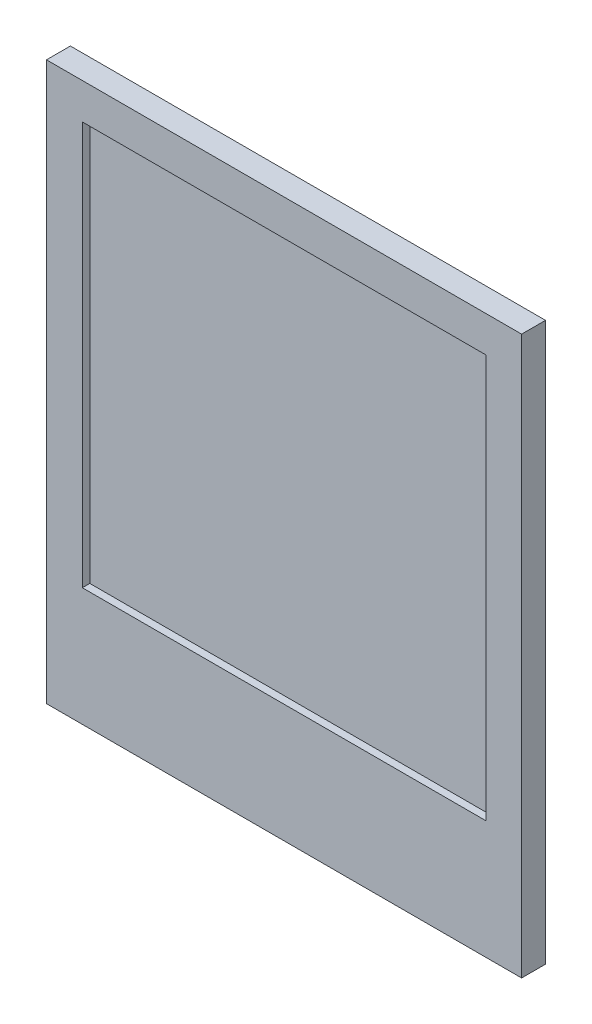
ISO-10303-21;
HEADER;
FILE_DESCRIPTION(('STEP AP214'),'2;1');
FILE_NAME('part.step','',(''),(''),'','','');
FILE_SCHEMA(('AUTOMOTIVE_DESIGN { 1 0 10303 214 1 1 1 1 }'));
ENDSEC;
DATA;
#1=APPLICATION_CONTEXT('core data for automotive mechanical design processes');
#2=APPLICATION_PROTOCOL_DEFINITION('international standard','automotive_design',2000,#1);
#3=PRODUCT_CONTEXT('',#1,'mechanical');
#4=PRODUCT('Part','Part','',(#3));
#5=PRODUCT_RELATED_PRODUCT_CATEGORY('part','',(#4));
#6=PRODUCT_DEFINITION_FORMATION('','',#4);
#7=PRODUCT_DEFINITION_CONTEXT('part definition',#1,'design');
#8=PRODUCT_DEFINITION('design','',#6,#7);
#9=PRODUCT_DEFINITION_SHAPE('','',#8);
#10=(LENGTH_UNIT() NAMED_UNIT(*) SI_UNIT(.MILLI.,.METRE.));
#11=(NAMED_UNIT(*) PLANE_ANGLE_UNIT() SI_UNIT($,.RADIAN.));
#12=(NAMED_UNIT(*) SI_UNIT($,.STERADIAN.) SOLID_ANGLE_UNIT());
#13=UNCERTAINTY_MEASURE_WITH_UNIT(LENGTH_MEASURE(1.E-05),#10,'distance_accuracy_value','');
#14=(GEOMETRIC_REPRESENTATION_CONTEXT(3) GLOBAL_UNCERTAINTY_ASSIGNED_CONTEXT((#13)) GLOBAL_UNIT_ASSIGNED_CONTEXT((#10,
#11,#12)) REPRESENTATION_CONTEXT('',''));
#15=CARTESIAN_POINT('',(0.,0.,0.));
#16=DIRECTION('',(0.,0.,1.));
#17=DIRECTION('',(1.,0.,0.));
#18=AXIS2_PLACEMENT_3D('',#15,#16,#17);
#19=CARTESIAN_POINT('',(15.9,18.66,1.6));
#20=DIRECTION('',(-1.,0.,0.));
#21=DIRECTION('',(0.,-1.,0.));
#22=AXIS2_PLACEMENT_3D('',#19,#20,#21);
#23=PLANE('',#22);
#24=DIRECTION('',(0.,1.,0.));
#25=VECTOR('',#24,1.);
#26=CARTESIAN_POINT('',(15.9,18.66,0.));
#27=LINE('',#26,#25);
#28=CARTESIAN_POINT('',(15.9,-18.66,0.));
#29=VERTEX_POINT('',#28);
#30=CARTESIAN_POINT('',(15.9,18.66,0.));
#31=VERTEX_POINT('',#30);
#32=EDGE_CURVE('E145',#29,#31,#27,.T.);
#33=ORIENTED_EDGE('',*,*,#32,.T.);
#34=DIRECTION('',(0.,0.,-1.));
#35=VECTOR('',#34,1.);
#36=CARTESIAN_POINT('',(15.9,18.66,1.6));
#37=LINE('',#36,#35);
#38=CARTESIAN_POINT('',(15.9,18.66,1.6));
#39=VERTEX_POINT('',#38);
#40=EDGE_CURVE('E11',#39,#31,#37,.T.);
#41=ORIENTED_EDGE('',*,*,#40,.F.);
#42=DIRECTION('',(0.,1.,0.));
#43=VECTOR('',#42,1.);
#44=CARTESIAN_POINT('',(15.9,18.66,1.6));
#45=LINE('',#44,#43);
#46=CARTESIAN_POINT('',(15.9,-18.66,1.6));
#47=VERTEX_POINT('',#46);
#48=EDGE_CURVE('E149',#47,#39,#45,.T.);
#49=ORIENTED_EDGE('',*,*,#48,.F.);
#50=DIRECTION('',(0.,0.,-1.));
#51=VECTOR('',#50,1.);
#52=CARTESIAN_POINT('',(15.9,-18.66,1.6));
#53=LINE('',#52,#51);
#54=EDGE_CURVE('E155',#47,#29,#53,.T.);
#55=ORIENTED_EDGE('',*,*,#54,.T.);
#56=EDGE_LOOP('',(#33,#41,#49,#55));
#57=FACE_BOUND('',#56,.T.);
#58=ADVANCED_FACE('F37',(#57),#23,.F.);
#59=CARTESIAN_POINT('',(-15.9,18.66,1.6));
#60=DIRECTION('',(0.,-1.,0.));
#61=DIRECTION('',(0.,0.,-1.));
#62=AXIS2_PLACEMENT_3D('',#59,#60,#61);
#63=PLANE('',#62);
#64=DIRECTION('',(-1.,0.,0.));
#65=VECTOR('',#64,1.);
#66=CARTESIAN_POINT('',(-15.9,18.66,0.));
#67=LINE('',#66,#65);
#68=CARTESIAN_POINT('',(-15.9,18.66,0.));
#69=VERTEX_POINT('',#68);
#70=EDGE_CURVE('E158',#31,#69,#67,.T.);
#71=ORIENTED_EDGE('',*,*,#70,.T.);
#72=DIRECTION('',(0.,0.,-1.));
#73=VECTOR('',#72,1.);
#74=CARTESIAN_POINT('',(-15.9,18.66,1.6));
#75=LINE('',#74,#73);
#76=CARTESIAN_POINT('',(-15.9,18.66,1.6));
#77=VERTEX_POINT('',#76);
#78=EDGE_CURVE('E44',#77,#69,#75,.T.);
#79=ORIENTED_EDGE('',*,*,#78,.F.);
#80=DIRECTION('',(-1.,0.,0.));
#81=VECTOR('',#80,1.);
#82=CARTESIAN_POINT('',(-15.9,18.66,1.6));
#83=LINE('',#82,#81);
#84=EDGE_CURVE('E88',#39,#77,#83,.T.);
#85=ORIENTED_EDGE('',*,*,#84,.F.);
#86=ORIENTED_EDGE('',*,*,#40,.T.);
#87=EDGE_LOOP('',(#71,#79,#85,#86));
#88=FACE_BOUND('',#87,.T.);
#89=ADVANCED_FACE('F187',(#88),#63,.F.);
#90=CARTESIAN_POINT('',(-15.9,18.66,1.6));
#91=DIRECTION('',(1.,0.,0.));
#92=DIRECTION('',(0.,1.,0.));
#93=AXIS2_PLACEMENT_3D('',#90,#91,#92);
#94=PLANE('',#93);
#95=DIRECTION('',(0.,-1.,0.));
#96=VECTOR('',#95,1.);
#97=CARTESIAN_POINT('',(-15.9,18.66,0.));
#98=LINE('',#97,#96);
#99=CARTESIAN_POINT('',(-15.9,-18.66,0.));
#100=VERTEX_POINT('',#99);
#101=EDGE_CURVE('E160',#69,#100,#98,.T.);
#102=ORIENTED_EDGE('',*,*,#101,.T.);
#103=DIRECTION('',(0.,0.,-1.));
#104=VECTOR('',#103,1.);
#105=CARTESIAN_POINT('',(-15.9,-18.66,1.6));
#106=LINE('',#105,#104);
#107=CARTESIAN_POINT('',(-15.9,-18.66,1.6));
#108=VERTEX_POINT('',#107);
#109=EDGE_CURVE('E164',#108,#100,#106,.T.);
#110=ORIENTED_EDGE('',*,*,#109,.F.);
#111=DIRECTION('',(0.,-1.,0.));
#112=VECTOR('',#111,1.);
#113=CARTESIAN_POINT('',(-15.9,18.66,1.6));
#114=LINE('',#113,#112);
#115=EDGE_CURVE('E152',#77,#108,#114,.T.);
#116=ORIENTED_EDGE('',*,*,#115,.F.);
#117=ORIENTED_EDGE('',*,*,#78,.T.);
#118=EDGE_LOOP('',(#102,#110,#116,#117));
#119=FACE_BOUND('',#118,.T.);
#120=ADVANCED_FACE('F169',(#119),#94,.F.);
#121=CARTESIAN_POINT('',(-15.9,-18.66,1.6));
#122=DIRECTION('',(0.,1.,0.));
#123=DIRECTION('',(0.,0.,1.));
#124=AXIS2_PLACEMENT_3D('',#121,#122,#123);
#125=PLANE('',#124);
#126=DIRECTION('',(1.,0.,0.));
#127=VECTOR('',#126,1.);
#128=CARTESIAN_POINT('',(-15.9,-18.66,0.));
#129=LINE('',#128,#127);
#130=EDGE_CURVE('E81',#100,#29,#129,.T.);
#131=ORIENTED_EDGE('',*,*,#130,.T.);
#132=ORIENTED_EDGE('',*,*,#54,.F.);
#133=DIRECTION('',(1.,0.,0.));
#134=VECTOR('',#133,1.);
#135=CARTESIAN_POINT('',(-15.9,-18.66,1.6));
#136=LINE('',#135,#134);
#137=EDGE_CURVE('E60',#108,#47,#136,.T.);
#138=ORIENTED_EDGE('',*,*,#137,.F.);
#139=ORIENTED_EDGE('',*,*,#109,.T.);
#140=EDGE_LOOP('',(#131,#132,#138,#139));
#141=FACE_BOUND('',#140,.T.);
#142=ADVANCED_FACE('F177',(#141),#125,.F.);
#143=CARTESIAN_POINT('',(0.,0.,1.6));
#144=DIRECTION('',(0.,0.,1.));
#145=DIRECTION('',(1.,0.,0.));
#146=AXIS2_PLACEMENT_3D('',#143,#144,#145);
#147=PLANE('',#146);
#148=DIRECTION('',(0.,1.,0.));
#149=VECTOR('',#148,1.);
#150=CARTESIAN_POINT('',(13.5,16.26,1.6));
#151=LINE('',#150,#149);
#152=CARTESIAN_POINT('',(13.5,-10.74,1.6));
#153=VERTEX_POINT('',#152);
#154=CARTESIAN_POINT('',(13.5,16.26,1.6));
#155=VERTEX_POINT('',#154);
#156=EDGE_CURVE('E51',#153,#155,#151,.T.);
#157=ORIENTED_EDGE('',*,*,#156,.F.);
#158=DIRECTION('',(1.,0.,0.));
#159=VECTOR('',#158,1.);
#160=CARTESIAN_POINT('',(-13.5,-10.74,1.6));
#161=LINE('',#160,#159);
#162=CARTESIAN_POINT('',(-13.5,-10.74,1.6));
#163=VERTEX_POINT('',#162);
#164=EDGE_CURVE('E130',#163,#153,#161,.T.);
#165=ORIENTED_EDGE('',*,*,#164,.F.);
#166=DIRECTION('',(0.,-1.,0.));
#167=VECTOR('',#166,1.);
#168=CARTESIAN_POINT('',(-13.5,16.26,1.6));
#169=LINE('',#168,#167);
#170=CARTESIAN_POINT('',(-13.5,16.26,1.6));
#171=VERTEX_POINT('',#170);
#172=EDGE_CURVE('E133',#171,#163,#169,.T.);
#173=ORIENTED_EDGE('',*,*,#172,.F.);
#174=DIRECTION('',(-1.,0.,0.));
#175=VECTOR('',#174,1.);
#176=CARTESIAN_POINT('',(-13.5,16.26,1.6));
#177=LINE('',#176,#175);
#178=EDGE_CURVE('E139',#155,#171,#177,.T.);
#179=ORIENTED_EDGE('',*,*,#178,.F.);
#180=EDGE_LOOP('',(#157,#165,#173,#179));
#181=FACE_BOUND('',#180,.T.);
#182=ORIENTED_EDGE('',*,*,#48,.T.);
#183=ORIENTED_EDGE('',*,*,#84,.T.);
#184=ORIENTED_EDGE('',*,*,#115,.T.);
#185=ORIENTED_EDGE('',*,*,#137,.T.);
#186=EDGE_LOOP('',(#182,#183,#184,#185));
#187=FACE_BOUND('',#186,.T.);
#188=ADVANCED_FACE('F179',(#181,#187),#147,.T.);
#189=CARTESIAN_POINT('',(0.,0.,0.));
#190=DIRECTION('',(0.,0.,1.));
#191=DIRECTION('',(1.,0.,0.));
#192=AXIS2_PLACEMENT_3D('',#189,#190,#191);
#193=PLANE('',#192);
#194=ORIENTED_EDGE('',*,*,#32,.F.);
#195=ORIENTED_EDGE('',*,*,#130,.F.);
#196=ORIENTED_EDGE('',*,*,#101,.F.);
#197=ORIENTED_EDGE('',*,*,#70,.F.);
#198=EDGE_LOOP('',(#194,#195,#196,#197));
#199=FACE_BOUND('',#198,.T.);
#200=ADVANCED_FACE('F173',(#199),#193,.F.);
#201=CARTESIAN_POINT('',(13.5,16.26,1.1));
#202=DIRECTION('',(1.,0.,0.));
#203=DIRECTION('',(0.,1.,0.));
#204=AXIS2_PLACEMENT_3D('',#201,#202,#203);
#205=PLANE('',#204);
#206=ORIENTED_EDGE('',*,*,#156,.T.);
#207=DIRECTION('',(0.,0.,1.));
#208=VECTOR('',#207,1.);
#209=CARTESIAN_POINT('',(13.5,16.26,1.1));
#210=LINE('',#209,#208);
#211=CARTESIAN_POINT('',(13.5,16.26,1.1));
#212=VERTEX_POINT('',#211);
#213=EDGE_CURVE('E108',#212,#155,#210,.T.);
#214=ORIENTED_EDGE('',*,*,#213,.F.);
#215=DIRECTION('',(0.,1.,0.));
#216=VECTOR('',#215,1.);
#217=CARTESIAN_POINT('',(13.5,16.26,1.1));
#218=LINE('',#217,#216);
#219=CARTESIAN_POINT('',(13.5,-10.74,1.1));
#220=VERTEX_POINT('',#219);
#221=EDGE_CURVE('E112',#220,#212,#218,.T.);
#222=ORIENTED_EDGE('',*,*,#221,.F.);
#223=DIRECTION('',(0.,0.,1.));
#224=VECTOR('',#223,1.);
#225=CARTESIAN_POINT('',(13.5,-10.74,1.1));
#226=LINE('',#225,#224);
#227=EDGE_CURVE('E143',#220,#153,#226,.T.);
#228=ORIENTED_EDGE('',*,*,#227,.T.);
#229=EDGE_LOOP('',(#206,#214,#222,#228));
#230=FACE_BOUND('',#229,.T.);
#231=ADVANCED_FACE('F110',(#230),#205,.F.);
#232=CARTESIAN_POINT('',(-13.5,-10.74,1.1));
#233=DIRECTION('',(0.,-1.,0.));
#234=DIRECTION('',(0.,0.,-1.));
#235=AXIS2_PLACEMENT_3D('',#232,#233,#234);
#236=PLANE('',#235);
#237=ORIENTED_EDGE('',*,*,#164,.T.);
#238=ORIENTED_EDGE('',*,*,#227,.F.);
#239=DIRECTION('',(1.,0.,0.));
#240=VECTOR('',#239,1.);
#241=CARTESIAN_POINT('',(-13.5,-10.74,1.1));
#242=LINE('',#241,#240);
#243=CARTESIAN_POINT('',(-13.5,-10.74,1.1));
#244=VERTEX_POINT('',#243);
#245=EDGE_CURVE('E118',#244,#220,#242,.T.);
#246=ORIENTED_EDGE('',*,*,#245,.F.);
#247=DIRECTION('',(0.,0.,1.));
#248=VECTOR('',#247,1.);
#249=CARTESIAN_POINT('',(-13.5,-10.74,1.1));
#250=LINE('',#249,#248);
#251=EDGE_CURVE('E146',#244,#163,#250,.T.);
#252=ORIENTED_EDGE('',*,*,#251,.T.);
#253=EDGE_LOOP('',(#237,#238,#246,#252));
#254=FACE_BOUND('',#253,.T.);
#255=ADVANCED_FACE('F226',(#254),#236,.F.);
#256=CARTESIAN_POINT('',(-13.5,16.26,1.1));
#257=DIRECTION('',(-1.,0.,0.));
#258=DIRECTION('',(0.,-1.,0.));
#259=AXIS2_PLACEMENT_3D('',#256,#257,#258);
#260=PLANE('',#259);
#261=ORIENTED_EDGE('',*,*,#172,.T.);
#262=ORIENTED_EDGE('',*,*,#251,.F.);
#263=DIRECTION('',(0.,-1.,0.));
#264=VECTOR('',#263,1.);
#265=CARTESIAN_POINT('',(-13.5,16.26,1.1));
#266=LINE('',#265,#264);
#267=CARTESIAN_POINT('',(-13.5,16.26,1.1));
#268=VERTEX_POINT('',#267);
#269=EDGE_CURVE('E126',#268,#244,#266,.T.);
#270=ORIENTED_EDGE('',*,*,#269,.F.);
#271=DIRECTION('',(0.,0.,1.));
#272=VECTOR('',#271,1.);
#273=CARTESIAN_POINT('',(-13.5,16.26,1.1));
#274=LINE('',#273,#272);
#275=EDGE_CURVE('E117',#268,#171,#274,.T.);
#276=ORIENTED_EDGE('',*,*,#275,.T.);
#277=EDGE_LOOP('',(#261,#262,#270,#276));
#278=FACE_BOUND('',#277,.T.);
#279=ADVANCED_FACE('F235',(#278),#260,.F.);
#280=CARTESIAN_POINT('',(-13.5,16.26,1.1));
#281=DIRECTION('',(0.,1.,0.));
#282=DIRECTION('',(0.,0.,1.));
#283=AXIS2_PLACEMENT_3D('',#280,#281,#282);
#284=PLANE('',#283);
#285=ORIENTED_EDGE('',*,*,#178,.T.);
#286=ORIENTED_EDGE('',*,*,#275,.F.);
#287=DIRECTION('',(-1.,0.,0.));
#288=VECTOR('',#287,1.);
#289=CARTESIAN_POINT('',(-13.5,16.26,1.1));
#290=LINE('',#289,#288);
#291=EDGE_CURVE('E121',#212,#268,#290,.T.);
#292=ORIENTED_EDGE('',*,*,#291,.F.);
#293=ORIENTED_EDGE('',*,*,#213,.T.);
#294=EDGE_LOOP('',(#285,#286,#292,#293));
#295=FACE_BOUND('',#294,.T.);
#296=ADVANCED_FACE('F122',(#295),#284,.F.);
#297=CARTESIAN_POINT('',(0.,0.,1.1));
#298=DIRECTION('',(0.,0.,1.));
#299=DIRECTION('',(1.,0.,0.));
#300=AXIS2_PLACEMENT_3D('',#297,#298,#299);
#301=PLANE('',#300);
#302=ORIENTED_EDGE('',*,*,#221,.T.);
#303=ORIENTED_EDGE('',*,*,#291,.T.);
#304=ORIENTED_EDGE('',*,*,#269,.T.);
#305=ORIENTED_EDGE('',*,*,#245,.T.);
#306=EDGE_LOOP('',(#302,#303,#304,#305));
#307=FACE_BOUND('',#306,.T.);
#308=ADVANCED_FACE('F128',(#307),#301,.T.);
#309=CLOSED_SHELL('',(#58,#89,#120,#142,#188,#200,#231,#255,#279,#296,#308));
#310=MANIFOLD_SOLID_BREP('B2',#309);
#311=ADVANCED_BREP_SHAPE_REPRESENTATION('',(#18,#310),#14);
#312=SHAPE_DEFINITION_REPRESENTATION(#9,#311);
ENDSEC;
END-ISO-10303-21;
